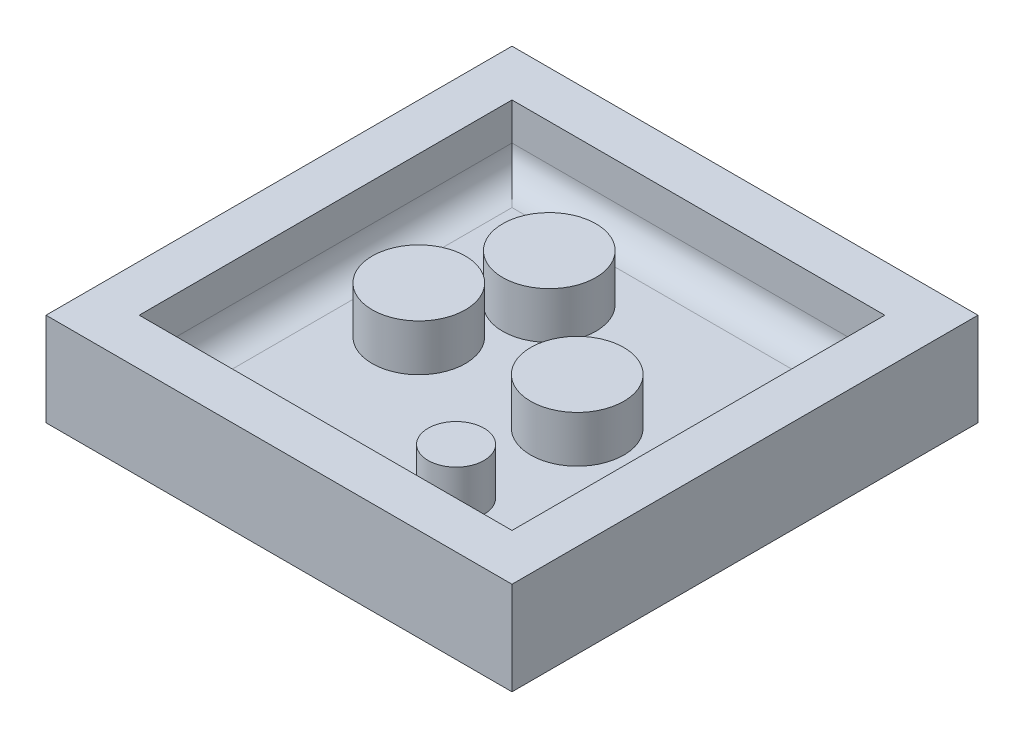
ISO-10303-21;
HEADER;
FILE_DESCRIPTION(('STEP AP214'),'2;1');
FILE_NAME('part.step','',(''),(''),'','','');
FILE_SCHEMA(('AUTOMOTIVE_DESIGN { 1 0 10303 214 1 1 1 1 }'));
ENDSEC;
DATA;
#1=APPLICATION_CONTEXT('core data for automotive mechanical design processes');
#2=APPLICATION_PROTOCOL_DEFINITION('international standard','automotive_design',2000,#1);
#3=PRODUCT_CONTEXT('',#1,'mechanical');
#4=PRODUCT('Part','Part','',(#3));
#5=PRODUCT_RELATED_PRODUCT_CATEGORY('part','',(#4));
#6=PRODUCT_DEFINITION_FORMATION('','',#4);
#7=PRODUCT_DEFINITION_CONTEXT('part definition',#1,'design');
#8=PRODUCT_DEFINITION('design','',#6,#7);
#9=PRODUCT_DEFINITION_SHAPE('','',#8);
#10=(LENGTH_UNIT() NAMED_UNIT(*) SI_UNIT(.MILLI.,.METRE.));
#11=(NAMED_UNIT(*) PLANE_ANGLE_UNIT() SI_UNIT($,.RADIAN.));
#12=(NAMED_UNIT(*) SI_UNIT($,.STERADIAN.) SOLID_ANGLE_UNIT());
#13=UNCERTAINTY_MEASURE_WITH_UNIT(LENGTH_MEASURE(1.E-05),#10,'distance_accuracy_value','');
#14=(GEOMETRIC_REPRESENTATION_CONTEXT(3) GLOBAL_UNCERTAINTY_ASSIGNED_CONTEXT((#13)) GLOBAL_UNIT_ASSIGNED_CONTEXT((#10,
#11,#12)) REPRESENTATION_CONTEXT('',''));
#15=CARTESIAN_POINT('',(0.,0.,0.));
#16=DIRECTION('',(0.,0.,1.));
#17=DIRECTION('',(1.,0.,0.));
#18=AXIS2_PLACEMENT_3D('',#15,#16,#17);
#19=CARTESIAN_POINT('',(0.,10.,0.));
#20=DIRECTION('',(1.,0.,0.));
#21=DIRECTION('',(0.,0.,-1.));
#22=AXIS2_PLACEMENT_3D('',#19,#20,#21);
#23=PLANE('',#22);
#24=DIRECTION('',(0.,0.,1.));
#25=VECTOR('',#24,1.);
#26=CARTESIAN_POINT('',(0.,0.,0.));
#27=LINE('',#26,#25);
#28=CARTESIAN_POINT('',(0.,0.,-50.));
#29=VERTEX_POINT('',#28);
#30=CARTESIAN_POINT('',(0.,0.,0.));
#31=VERTEX_POINT('',#30);
#32=EDGE_CURVE('E153',#29,#31,#27,.T.);
#33=ORIENTED_EDGE('',*,*,#32,.T.);
#34=DIRECTION('',(0.,-1.,0.));
#35=VECTOR('',#34,1.);
#36=CARTESIAN_POINT('',(0.,10.,0.));
#37=LINE('',#36,#35);
#38=CARTESIAN_POINT('',(0.,10.,0.));
#39=VERTEX_POINT('',#38);
#40=EDGE_CURVE('E195',#39,#31,#37,.T.);
#41=ORIENTED_EDGE('',*,*,#40,.F.);
#42=DIRECTION('',(0.,0.,1.));
#43=VECTOR('',#42,1.);
#44=CARTESIAN_POINT('',(0.,10.,0.));
#45=LINE('',#44,#43);
#46=CARTESIAN_POINT('',(0.,10.,-50.));
#47=VERTEX_POINT('',#46);
#48=EDGE_CURVE('E158',#47,#39,#45,.T.);
#49=ORIENTED_EDGE('',*,*,#48,.F.);
#50=DIRECTION('',(0.,-1.,0.));
#51=VECTOR('',#50,1.);
#52=CARTESIAN_POINT('',(0.,10.,-50.));
#53=LINE('',#52,#51);
#54=EDGE_CURVE('E172',#47,#29,#53,.T.);
#55=ORIENTED_EDGE('',*,*,#54,.T.);
#56=EDGE_LOOP('',(#33,#41,#49,#55));
#57=FACE_BOUND('',#56,.T.);
#58=ADVANCED_FACE('F39',(#57),#23,.F.);
#59=CARTESIAN_POINT('',(0.,10.,0.));
#60=DIRECTION('',(0.,0.,-1.));
#61=DIRECTION('',(-1.,0.,0.));
#62=AXIS2_PLACEMENT_3D('',#59,#60,#61);
#63=PLANE('',#62);
#64=DIRECTION('',(1.,0.,0.));
#65=VECTOR('',#64,1.);
#66=CARTESIAN_POINT('',(0.,0.,0.));
#67=LINE('',#66,#65);
#68=CARTESIAN_POINT('',(50.,0.,0.));
#69=VERTEX_POINT('',#68);
#70=EDGE_CURVE('E176',#31,#69,#67,.T.);
#71=ORIENTED_EDGE('',*,*,#70,.T.);
#72=DIRECTION('',(0.,-1.,0.));
#73=VECTOR('',#72,1.);
#74=CARTESIAN_POINT('',(50.,10.,0.));
#75=LINE('',#74,#73);
#76=CARTESIAN_POINT('',(50.,10.,0.));
#77=VERTEX_POINT('',#76);
#78=EDGE_CURVE('E191',#77,#69,#75,.T.);
#79=ORIENTED_EDGE('',*,*,#78,.F.);
#80=DIRECTION('',(1.,0.,0.));
#81=VECTOR('',#80,1.);
#82=CARTESIAN_POINT('',(0.,10.,0.));
#83=LINE('',#82,#81);
#84=EDGE_CURVE('E162',#39,#77,#83,.T.);
#85=ORIENTED_EDGE('',*,*,#84,.F.);
#86=ORIENTED_EDGE('',*,*,#40,.T.);
#87=EDGE_LOOP('',(#71,#79,#85,#86));
#88=FACE_BOUND('',#87,.T.);
#89=ADVANCED_FACE('F314',(#88),#63,.F.);
#90=CARTESIAN_POINT('',(50.,10.,0.));
#91=DIRECTION('',(-1.,0.,0.));
#92=DIRECTION('',(0.,0.,1.));
#93=AXIS2_PLACEMENT_3D('',#90,#91,#92);
#94=PLANE('',#93);
#95=DIRECTION('',(0.,0.,-1.));
#96=VECTOR('',#95,1.);
#97=CARTESIAN_POINT('',(50.,0.,0.));
#98=LINE('',#97,#96);
#99=CARTESIAN_POINT('',(50.,0.,-50.));
#100=VERTEX_POINT('',#99);
#101=EDGE_CURVE('E179',#69,#100,#98,.T.);
#102=ORIENTED_EDGE('',*,*,#101,.T.);
#103=DIRECTION('',(0.,-1.,0.));
#104=VECTOR('',#103,1.);
#105=CARTESIAN_POINT('',(50.,10.,-50.));
#106=LINE('',#105,#104);
#107=CARTESIAN_POINT('',(50.,10.,-50.));
#108=VERTEX_POINT('',#107);
#109=EDGE_CURVE('E187',#108,#100,#106,.T.);
#110=ORIENTED_EDGE('',*,*,#109,.F.);
#111=DIRECTION('',(0.,0.,-1.));
#112=VECTOR('',#111,1.);
#113=CARTESIAN_POINT('',(50.,10.,0.));
#114=LINE('',#113,#112);
#115=EDGE_CURVE('E166',#77,#108,#114,.T.);
#116=ORIENTED_EDGE('',*,*,#115,.F.);
#117=ORIENTED_EDGE('',*,*,#78,.T.);
#118=EDGE_LOOP('',(#102,#110,#116,#117));
#119=FACE_BOUND('',#118,.T.);
#120=ADVANCED_FACE('F320',(#119),#94,.F.);
#121=CARTESIAN_POINT('',(0.,10.,-50.));
#122=DIRECTION('',(0.,0.,1.));
#123=DIRECTION('',(1.,0.,0.));
#124=AXIS2_PLACEMENT_3D('',#121,#122,#123);
#125=PLANE('',#124);
#126=DIRECTION('',(-1.,0.,0.));
#127=VECTOR('',#126,1.);
#128=CARTESIAN_POINT('',(0.,0.,-50.));
#129=LINE('',#128,#127);
#130=EDGE_CURVE('E163',#100,#29,#129,.T.);
#131=ORIENTED_EDGE('',*,*,#130,.T.);
#132=ORIENTED_EDGE('',*,*,#54,.F.);
#133=DIRECTION('',(-1.,0.,0.));
#134=VECTOR('',#133,1.);
#135=CARTESIAN_POINT('',(0.,10.,-50.));
#136=LINE('',#135,#134);
#137=EDGE_CURVE('E169',#108,#47,#136,.T.);
#138=ORIENTED_EDGE('',*,*,#137,.F.);
#139=ORIENTED_EDGE('',*,*,#109,.T.);
#140=EDGE_LOOP('',(#131,#132,#138,#139));
#141=FACE_BOUND('',#140,.T.);
#142=ADVANCED_FACE('F370',(#141),#125,.F.);
#143=CARTESIAN_POINT('',(0.,10.,0.));
#144=DIRECTION('',(0.,-1.,0.));
#145=DIRECTION('',(0.,0.,-1.));
#146=AXIS2_PLACEMENT_3D('',#143,#144,#145);
#147=PLANE('',#146);
#148=DIRECTION('',(1.,0.,0.));
#149=VECTOR('',#148,1.);
#150=CARTESIAN_POINT('',(5.00000000000001,10.,-5.));
#151=LINE('',#150,#149);
#152=CARTESIAN_POINT('',(5.00000000000001,10.,-5.));
#153=VERTEX_POINT('',#152);
#154=CARTESIAN_POINT('',(45.,10.,-5.));
#155=VERTEX_POINT('',#154);
#156=EDGE_CURVE('E132',#153,#155,#151,.T.);
#157=ORIENTED_EDGE('',*,*,#156,.F.);
#158=DIRECTION('',(0.,0.,1.));
#159=VECTOR('',#158,1.);
#160=CARTESIAN_POINT('',(5.,10.,-45.));
#161=LINE('',#160,#159);
#162=CARTESIAN_POINT('',(5.,10.,-45.));
#163=VERTEX_POINT('',#162);
#164=EDGE_CURVE('E138',#163,#153,#161,.T.);
#165=ORIENTED_EDGE('',*,*,#164,.F.);
#166=DIRECTION('',(-1.,0.,0.));
#167=VECTOR('',#166,1.);
#168=CARTESIAN_POINT('',(5.,10.,-45.));
#169=LINE('',#168,#167);
#170=CARTESIAN_POINT('',(45.,10.,-45.));
#171=VERTEX_POINT('',#170);
#172=EDGE_CURVE('E143',#171,#163,#169,.T.);
#173=ORIENTED_EDGE('',*,*,#172,.F.);
#174=DIRECTION('',(0.,0.,-1.));
#175=VECTOR('',#174,1.);
#176=CARTESIAN_POINT('',(45.,10.,-45.));
#177=LINE('',#176,#175);
#178=EDGE_CURVE('E123',#155,#171,#177,.T.);
#179=ORIENTED_EDGE('',*,*,#178,.F.);
#180=EDGE_LOOP('',(#157,#165,#173,#179));
#181=FACE_BOUND('',#180,.T.);
#182=ORIENTED_EDGE('',*,*,#48,.T.);
#183=ORIENTED_EDGE('',*,*,#84,.T.);
#184=ORIENTED_EDGE('',*,*,#115,.T.);
#185=ORIENTED_EDGE('',*,*,#137,.T.);
#186=EDGE_LOOP('',(#182,#183,#184,#185));
#187=FACE_BOUND('',#186,.T.);
#188=ADVANCED_FACE('F140',(#181,#187),#147,.F.);
#189=CARTESIAN_POINT('',(0.,0.,0.));
#190=DIRECTION('',(0.,-1.,0.));
#191=DIRECTION('',(0.,0.,-1.));
#192=AXIS2_PLACEMENT_3D('',#189,#190,#191);
#193=PLANE('',#192);
#194=ORIENTED_EDGE('',*,*,#32,.F.);
#195=ORIENTED_EDGE('',*,*,#130,.F.);
#196=ORIENTED_EDGE('',*,*,#101,.F.);
#197=ORIENTED_EDGE('',*,*,#70,.F.);
#198=EDGE_LOOP('',(#194,#195,#196,#197));
#199=FACE_BOUND('',#198,.T.);
#200=ADVANCED_FACE('F302',(#199),#193,.T.);
#201=CARTESIAN_POINT('',(5.,3.,-45.));
#202=DIRECTION('',(-1.,0.,0.));
#203=DIRECTION('',(0.,0.,1.));
#204=AXIS2_PLACEMENT_3D('',#201,#202,#203);
#205=PLANE('',#204);
#206=DIRECTION('',(0.,1.,0.));
#207=VECTOR('',#206,1.);
#208=CARTESIAN_POINT('',(5.00000000000001,3.,-5.));
#209=LINE('',#208,#207);
#210=CARTESIAN_POINT('',(5.00000000000001,6.,-5.));
#211=VERTEX_POINT('',#210);
#212=EDGE_CURVE('E129',#211,#153,#209,.T.);
#213=ORIENTED_EDGE('',*,*,#212,.F.);
#214=DIRECTION('',(0.,0.,1.));
#215=VECTOR('',#214,1.);
#216=CARTESIAN_POINT('',(5.,6.,-45.));
#217=LINE('',#216,#215);
#218=CARTESIAN_POINT('',(5.,6.,-45.));
#219=VERTEX_POINT('',#218);
#220=EDGE_CURVE('E49',#211,#219,#217,.F.);
#221=ORIENTED_EDGE('',*,*,#220,.T.);
#222=DIRECTION('',(0.,1.,0.));
#223=VECTOR('',#222,1.);
#224=CARTESIAN_POINT('',(5.,3.,-45.));
#225=LINE('',#224,#223);
#226=EDGE_CURVE('E150',#219,#163,#225,.T.);
#227=ORIENTED_EDGE('',*,*,#226,.T.);
#228=ORIENTED_EDGE('',*,*,#164,.T.);
#229=EDGE_LOOP('',(#213,#221,#227,#228));
#230=FACE_BOUND('',#229,.T.);
#231=ADVANCED_FACE('F300',(#230),#205,.F.);
#232=CARTESIAN_POINT('',(5.,3.,-45.));
#233=DIRECTION('',(0.,0.,-1.));
#234=DIRECTION('',(-1.,0.,0.));
#235=AXIS2_PLACEMENT_3D('',#232,#233,#234);
#236=PLANE('',#235);
#237=ORIENTED_EDGE('',*,*,#226,.F.);
#238=DIRECTION('',(-1.,0.,0.));
#239=VECTOR('',#238,1.);
#240=CARTESIAN_POINT('',(5.,6.,-45.));
#241=LINE('',#240,#239);
#242=CARTESIAN_POINT('',(45.,6.,-45.));
#243=VERTEX_POINT('',#242);
#244=EDGE_CURVE('E11',#219,#243,#241,.F.);
#245=ORIENTED_EDGE('',*,*,#244,.T.);
#246=DIRECTION('',(0.,1.,0.));
#247=VECTOR('',#246,1.);
#248=CARTESIAN_POINT('',(45.,3.,-45.));
#249=LINE('',#248,#247);
#250=EDGE_CURVE('E128',#243,#171,#249,.T.);
#251=ORIENTED_EDGE('',*,*,#250,.T.);
#252=ORIENTED_EDGE('',*,*,#172,.T.);
#253=EDGE_LOOP('',(#237,#245,#251,#252));
#254=FACE_BOUND('',#253,.T.);
#255=ADVANCED_FACE('F299',(#254),#236,.F.);
#256=CARTESIAN_POINT('',(45.,3.,-45.));
#257=DIRECTION('',(1.,0.,0.));
#258=DIRECTION('',(0.,0.,-1.));
#259=AXIS2_PLACEMENT_3D('',#256,#257,#258);
#260=PLANE('',#259);
#261=ORIENTED_EDGE('',*,*,#250,.F.);
#262=DIRECTION('',(0.,0.,-1.));
#263=VECTOR('',#262,1.);
#264=CARTESIAN_POINT('',(45.,6.,-45.));
#265=LINE('',#264,#263);
#266=CARTESIAN_POINT('',(45.,6.,-5.));
#267=VERTEX_POINT('',#266);
#268=EDGE_CURVE('E126',#243,#267,#265,.F.);
#269=ORIENTED_EDGE('',*,*,#268,.T.);
#270=DIRECTION('',(0.,1.,0.));
#271=VECTOR('',#270,1.);
#272=CARTESIAN_POINT('',(45.,3.,-5.));
#273=LINE('',#272,#271);
#274=EDGE_CURVE('E118',#267,#155,#273,.T.);
#275=ORIENTED_EDGE('',*,*,#274,.T.);
#276=ORIENTED_EDGE('',*,*,#178,.T.);
#277=EDGE_LOOP('',(#261,#269,#275,#276));
#278=FACE_BOUND('',#277,.T.);
#279=ADVANCED_FACE('F121',(#278),#260,.F.);
#280=CARTESIAN_POINT('',(5.00000000000001,3.,-5.));
#281=DIRECTION('',(0.,0.,1.));
#282=DIRECTION('',(1.,0.,0.));
#283=AXIS2_PLACEMENT_3D('',#280,#281,#282);
#284=PLANE('',#283);
#285=ORIENTED_EDGE('',*,*,#274,.F.);
#286=DIRECTION('',(1.,0.,0.));
#287=VECTOR('',#286,1.);
#288=CARTESIAN_POINT('',(5.00000000000001,6.,-5.));
#289=LINE('',#288,#287);
#290=EDGE_CURVE('E64',#267,#211,#289,.F.);
#291=ORIENTED_EDGE('',*,*,#290,.T.);
#292=ORIENTED_EDGE('',*,*,#212,.T.);
#293=ORIENTED_EDGE('',*,*,#156,.T.);
#294=EDGE_LOOP('',(#285,#291,#292,#293));
#295=FACE_BOUND('',#294,.T.);
#296=ADVANCED_FACE('F133',(#295),#284,.F.);
#297=CARTESIAN_POINT('',(0.,3.,0.));
#298=DIRECTION('',(0.,1.,0.));
#299=DIRECTION('',(0.,0.,1.));
#300=AXIS2_PLACEMENT_3D('',#297,#298,#299);
#301=PLANE('',#300);
#302=CARTESIAN_POINT('',(32.,3.,-12.));
#303=DIRECTION('',(0.,1.,0.));
#304=DIRECTION('',(0.,0.,1.));
#305=AXIS2_PLACEMENT_3D('',#302,#303,#304);
#306=CIRCLE('',#305,3.);
#307=CARTESIAN_POINT('',(32.,3.,-9.));
#308=VERTEX_POINT('',#307);
#309=EDGE_CURVE('E262',#308,#308,#306,.T.);
#310=ORIENTED_EDGE('',*,*,#309,.F.);
#311=EDGE_LOOP('',(#310));
#312=FACE_BOUND('',#311,.T.);
#313=CARTESIAN_POINT('',(15.,3.,-25.));
#314=DIRECTION('',(0.,1.,0.));
#315=DIRECTION('',(0.,0.,1.));
#316=AXIS2_PLACEMENT_3D('',#313,#314,#315);
#317=CIRCLE('',#316,5.);
#318=CARTESIAN_POINT('',(15.,3.,-20.));
#319=VERTEX_POINT('',#318);
#320=EDGE_CURVE('E254',#319,#319,#317,.T.);
#321=ORIENTED_EDGE('',*,*,#320,.F.);
#322=EDGE_LOOP('',(#321));
#323=FACE_BOUND('',#322,.T.);
#324=CARTESIAN_POINT('',(32.,3.,-25.));
#325=DIRECTION('',(0.,1.,0.));
#326=DIRECTION('',(0.,0.,1.));
#327=AXIS2_PLACEMENT_3D('',#324,#325,#326);
#328=CIRCLE('',#327,5.);
#329=CARTESIAN_POINT('',(32.,3.,-20.));
#330=VERTEX_POINT('',#329);
#331=EDGE_CURVE('E246',#330,#330,#328,.T.);
#332=ORIENTED_EDGE('',*,*,#331,.F.);
#333=EDGE_LOOP('',(#332));
#334=FACE_BOUND('',#333,.T.);
#335=CARTESIAN_POINT('',(19.,3.,-35.));
#336=DIRECTION('',(0.,1.,0.));
#337=DIRECTION('',(0.,0.,1.));
#338=AXIS2_PLACEMENT_3D('',#335,#336,#337);
#339=CIRCLE('',#338,5.);
#340=CARTESIAN_POINT('',(19.,3.,-30.));
#341=VERTEX_POINT('',#340);
#342=EDGE_CURVE('E238',#341,#341,#339,.T.);
#343=ORIENTED_EDGE('',*,*,#342,.F.);
#344=EDGE_LOOP('',(#343));
#345=FACE_BOUND('',#344,.T.);
#346=DIRECTION('',(1.,0.,0.));
#347=VECTOR('',#346,1.);
#348=CARTESIAN_POINT('',(0.,3.,-8.));
#349=LINE('',#348,#347);
#350=CARTESIAN_POINT('',(8.00000000000001,3.,-8.));
#351=VERTEX_POINT('',#350);
#352=CARTESIAN_POINT('',(42.,3.,-8.));
#353=VERTEX_POINT('',#352);
#354=EDGE_CURVE('E205',#351,#353,#349,.T.);
#355=ORIENTED_EDGE('',*,*,#354,.T.);
#356=DIRECTION('',(0.,0.,-1.));
#357=VECTOR('',#356,1.);
#358=CARTESIAN_POINT('',(42.,3.,0.));
#359=LINE('',#358,#357);
#360=CARTESIAN_POINT('',(42.,3.,-42.));
#361=VERTEX_POINT('',#360);
#362=EDGE_CURVE('E208',#353,#361,#359,.T.);
#363=ORIENTED_EDGE('',*,*,#362,.T.);
#364=DIRECTION('',(-1.,0.,0.));
#365=VECTOR('',#364,1.);
#366=CARTESIAN_POINT('',(0.,3.,-42.));
#367=LINE('',#366,#365);
#368=CARTESIAN_POINT('',(8.,3.,-42.));
#369=VERTEX_POINT('',#368);
#370=EDGE_CURVE('E199',#361,#369,#367,.T.);
#371=ORIENTED_EDGE('',*,*,#370,.T.);
#372=DIRECTION('',(0.,0.,1.));
#373=VECTOR('',#372,1.);
#374=CARTESIAN_POINT('',(8.00000000000001,3.,0.));
#375=LINE('',#374,#373);
#376=EDGE_CURVE('E202',#369,#351,#375,.T.);
#377=ORIENTED_EDGE('',*,*,#376,.T.);
#378=EDGE_LOOP('',(#355,#363,#371,#377));
#379=FACE_BOUND('',#378,.T.);
#380=ADVANCED_FACE('F279',(#312,#323,#334,#345,#379),#301,.T.);
#381=CARTESIAN_POINT('',(8.00000000000001,6.,0.));
#382=DIRECTION('',(0.,0.,1.));
#383=DIRECTION('',(1.,0.,0.));
#384=AXIS2_PLACEMENT_3D('',#381,#382,#383);
#385=CYLINDRICAL_SURFACE('',#384,3.);
#386=CARTESIAN_POINT('',(8.,6.,-42.));
#387=DIRECTION('',(-0.707106781186547,0.,0.707106781186548));
#388=DIRECTION('',(0.707106781186547,0.,0.707106781186547));
#389=AXIS2_PLACEMENT_3D('',#386,#387,#388);
#390=ELLIPSE('',#389,4.24264068711929,3.);
#391=EDGE_CURVE('E224',#219,#369,#390,.T.);
#392=ORIENTED_EDGE('',*,*,#391,.F.);
#393=ORIENTED_EDGE('',*,*,#220,.F.);
#394=CARTESIAN_POINT('',(8.,6.,-8.));
#395=DIRECTION('',(0.707106781186547,0.,0.707106781186547));
#396=DIRECTION('',(0.707106781186547,0.,-0.707106781186548));
#397=AXIS2_PLACEMENT_3D('',#394,#395,#396);
#398=ELLIPSE('',#397,4.24264068711928,3.);
#399=EDGE_CURVE('E43',#351,#211,#398,.F.);
#400=ORIENTED_EDGE('',*,*,#399,.F.);
#401=ORIENTED_EDGE('',*,*,#376,.F.);
#402=EDGE_LOOP('',(#392,#393,#400,#401));
#403=FACE_BOUND('',#402,.T.);
#404=ADVANCED_FACE('F41',(#403),#385,.F.);
#405=CARTESIAN_POINT('',(0.,6.,-8.));
#406=DIRECTION('',(1.,0.,0.));
#407=DIRECTION('',(0.,0.,-1.));
#408=AXIS2_PLACEMENT_3D('',#405,#406,#407);
#409=CYLINDRICAL_SURFACE('',#408,3.);
#410=ORIENTED_EDGE('',*,*,#399,.T.);
#411=ORIENTED_EDGE('',*,*,#290,.F.);
#412=CARTESIAN_POINT('',(42.,6.,-8.));
#413=DIRECTION('',(0.707106781186547,0.,-0.707106781186547));
#414=DIRECTION('',(-0.707106781186547,0.,-0.707106781186547));
#415=AXIS2_PLACEMENT_3D('',#412,#413,#414);
#416=ELLIPSE('',#415,4.24264068711928,3.);
#417=EDGE_CURVE('E221',#353,#267,#416,.F.);
#418=ORIENTED_EDGE('',*,*,#417,.F.);
#419=ORIENTED_EDGE('',*,*,#354,.F.);
#420=EDGE_LOOP('',(#410,#411,#418,#419));
#421=FACE_BOUND('',#420,.T.);
#422=ADVANCED_FACE('F292',(#421),#409,.F.);
#423=CARTESIAN_POINT('',(0.,6.,-42.));
#424=DIRECTION('',(-1.,0.,0.));
#425=DIRECTION('',(0.,0.,1.));
#426=AXIS2_PLACEMENT_3D('',#423,#424,#425);
#427=CYLINDRICAL_SURFACE('',#426,3.);
#428=ORIENTED_EDGE('',*,*,#391,.T.);
#429=ORIENTED_EDGE('',*,*,#370,.F.);
#430=CARTESIAN_POINT('',(42.,6.,-42.));
#431=DIRECTION('',(-0.707106781186547,0.,-0.707106781186547));
#432=DIRECTION('',(0.707106781186547,0.,-0.707106781186547));
#433=AXIS2_PLACEMENT_3D('',#430,#431,#432);
#434=ELLIPSE('',#433,4.24264068711928,3.);
#435=EDGE_CURVE('E218',#243,#361,#434,.T.);
#436=ORIENTED_EDGE('',*,*,#435,.F.);
#437=ORIENTED_EDGE('',*,*,#244,.F.);
#438=EDGE_LOOP('',(#428,#429,#436,#437));
#439=FACE_BOUND('',#438,.T.);
#440=ADVANCED_FACE('F296',(#439),#427,.F.);
#441=CARTESIAN_POINT('',(42.,6.,0.));
#442=DIRECTION('',(0.,0.,-1.));
#443=DIRECTION('',(-1.,0.,0.));
#444=AXIS2_PLACEMENT_3D('',#441,#442,#443);
#445=CYLINDRICAL_SURFACE('',#444,3.);
#446=ORIENTED_EDGE('',*,*,#417,.T.);
#447=ORIENTED_EDGE('',*,*,#268,.F.);
#448=ORIENTED_EDGE('',*,*,#435,.T.);
#449=ORIENTED_EDGE('',*,*,#362,.F.);
#450=EDGE_LOOP('',(#446,#447,#448,#449));
#451=FACE_BOUND('',#450,.T.);
#452=ADVANCED_FACE('F294',(#451),#445,.F.);
#453=CARTESIAN_POINT('',(19.,8.,-35.));
#454=DIRECTION('',(0.,-1.,0.));
#455=DIRECTION('',(0.,0.,-1.));
#456=AXIS2_PLACEMENT_3D('',#453,#454,#455);
#457=CYLINDRICAL_SURFACE('',#456,5.);
#458=CARTESIAN_POINT('',(19.,8.,-35.));
#459=DIRECTION('',(0.,1.,0.));
#460=DIRECTION('',(0.,0.,1.));
#461=AXIS2_PLACEMENT_3D('',#458,#459,#460);
#462=CIRCLE('',#461,5.);
#463=CARTESIAN_POINT('',(19.,8.,-30.));
#464=VERTEX_POINT('',#463);
#465=EDGE_CURVE('E222',#464,#464,#462,.T.);
#466=ORIENTED_EDGE('',*,*,#465,.F.);
#467=EDGE_LOOP('',(#466));
#468=FACE_BOUND('',#467,.T.);
#469=ORIENTED_EDGE('',*,*,#342,.T.);
#470=EDGE_LOOP('',(#469));
#471=FACE_BOUND('',#470,.T.);
#472=ADVANCED_FACE('F327',(#468,#471),#457,.T.);
#473=CARTESIAN_POINT('',(19.,8.,-35.));
#474=DIRECTION('',(0.,1.,0.));
#475=DIRECTION('',(0.,0.,1.));
#476=AXIS2_PLACEMENT_3D('',#473,#474,#475);
#477=PLANE('',#476);
#478=ORIENTED_EDGE('',*,*,#465,.T.);
#479=EDGE_LOOP('',(#478));
#480=FACE_BOUND('',#479,.T.);
#481=ADVANCED_FACE('F441',(#480),#477,.T.);
#482=CARTESIAN_POINT('',(32.,8.,-25.));
#483=DIRECTION('',(0.,-1.,0.));
#484=DIRECTION('',(0.,0.,-1.));
#485=AXIS2_PLACEMENT_3D('',#482,#483,#484);
#486=CYLINDRICAL_SURFACE('',#485,5.);
#487=CARTESIAN_POINT('',(32.,8.,-25.));
#488=DIRECTION('',(0.,1.,0.));
#489=DIRECTION('',(0.,0.,1.));
#490=AXIS2_PLACEMENT_3D('',#487,#488,#489);
#491=CIRCLE('',#490,5.);
#492=CARTESIAN_POINT('',(32.,8.,-20.));
#493=VERTEX_POINT('',#492);
#494=EDGE_CURVE('E242',#493,#493,#491,.T.);
#495=ORIENTED_EDGE('',*,*,#494,.F.);
#496=EDGE_LOOP('',(#495));
#497=FACE_BOUND('',#496,.T.);
#498=ORIENTED_EDGE('',*,*,#331,.T.);
#499=EDGE_LOOP('',(#498));
#500=FACE_BOUND('',#499,.T.);
#501=ADVANCED_FACE('F450',(#497,#500),#486,.T.);
#502=CARTESIAN_POINT('',(32.,8.,-25.));
#503=DIRECTION('',(0.,1.,0.));
#504=DIRECTION('',(0.,0.,1.));
#505=AXIS2_PLACEMENT_3D('',#502,#503,#504);
#506=PLANE('',#505);
#507=ORIENTED_EDGE('',*,*,#494,.T.);
#508=EDGE_LOOP('',(#507));
#509=FACE_BOUND('',#508,.T.);
#510=ADVANCED_FACE('F459',(#509),#506,.T.);
#511=CARTESIAN_POINT('',(15.,8.,-25.));
#512=DIRECTION('',(0.,-1.,0.));
#513=DIRECTION('',(0.,0.,-1.));
#514=AXIS2_PLACEMENT_3D('',#511,#512,#513);
#515=CYLINDRICAL_SURFACE('',#514,5.);
#516=CARTESIAN_POINT('',(15.,8.,-25.));
#517=DIRECTION('',(0.,1.,0.));
#518=DIRECTION('',(0.,0.,1.));
#519=AXIS2_PLACEMENT_3D('',#516,#517,#518);
#520=CIRCLE('',#519,5.);
#521=CARTESIAN_POINT('',(15.,8.,-20.));
#522=VERTEX_POINT('',#521);
#523=EDGE_CURVE('E250',#522,#522,#520,.T.);
#524=ORIENTED_EDGE('',*,*,#523,.F.);
#525=EDGE_LOOP('',(#524));
#526=FACE_BOUND('',#525,.T.);
#527=ORIENTED_EDGE('',*,*,#320,.T.);
#528=EDGE_LOOP('',(#527));
#529=FACE_BOUND('',#528,.T.);
#530=ADVANCED_FACE('F468',(#526,#529),#515,.T.);
#531=CARTESIAN_POINT('',(15.,8.,-25.));
#532=DIRECTION('',(0.,1.,0.));
#533=DIRECTION('',(0.,0.,1.));
#534=AXIS2_PLACEMENT_3D('',#531,#532,#533);
#535=PLANE('',#534);
#536=ORIENTED_EDGE('',*,*,#523,.T.);
#537=EDGE_LOOP('',(#536));
#538=FACE_BOUND('',#537,.T.);
#539=ADVANCED_FACE('F275',(#538),#535,.T.);
#540=CARTESIAN_POINT('',(32.,8.,-12.));
#541=DIRECTION('',(0.,-1.,0.));
#542=DIRECTION('',(0.,0.,-1.));
#543=AXIS2_PLACEMENT_3D('',#540,#541,#542);
#544=CYLINDRICAL_SURFACE('',#543,3.);
#545=CARTESIAN_POINT('',(32.,8.,-12.));
#546=DIRECTION('',(0.,1.,0.));
#547=DIRECTION('',(0.,0.,1.));
#548=AXIS2_PLACEMENT_3D('',#545,#546,#547);
#549=CIRCLE('',#548,3.);
#550=CARTESIAN_POINT('',(32.,8.,-9.));
#551=VERTEX_POINT('',#550);
#552=EDGE_CURVE('E258',#551,#551,#549,.T.);
#553=ORIENTED_EDGE('',*,*,#552,.F.);
#554=EDGE_LOOP('',(#553));
#555=FACE_BOUND('',#554,.T.);
#556=ORIENTED_EDGE('',*,*,#309,.T.);
#557=EDGE_LOOP('',(#556));
#558=FACE_BOUND('',#557,.T.);
#559=ADVANCED_FACE('F272',(#555,#558),#544,.T.);
#560=CARTESIAN_POINT('',(32.,8.,-12.));
#561=DIRECTION('',(0.,1.,0.));
#562=DIRECTION('',(0.,0.,1.));
#563=AXIS2_PLACEMENT_3D('',#560,#561,#562);
#564=PLANE('',#563);
#565=ORIENTED_EDGE('',*,*,#552,.T.);
#566=EDGE_LOOP('',(#565));
#567=FACE_BOUND('',#566,.T.);
#568=ADVANCED_FACE('F270',(#567),#564,.T.);
#569=CLOSED_SHELL('',(#58,#89,#120,#142,#188,#200,#231,#255,#279,#296,#380,#404,#422,#440,#452,
#472,#481,#501,#510,#530,#539,#559,#568));
#570=MANIFOLD_SOLID_BREP('B2',#569);
#571=ADVANCED_BREP_SHAPE_REPRESENTATION('',(#18,#570),#14);
#572=SHAPE_DEFINITION_REPRESENTATION(#9,#571);
ENDSEC;
END-ISO-10303-21;
